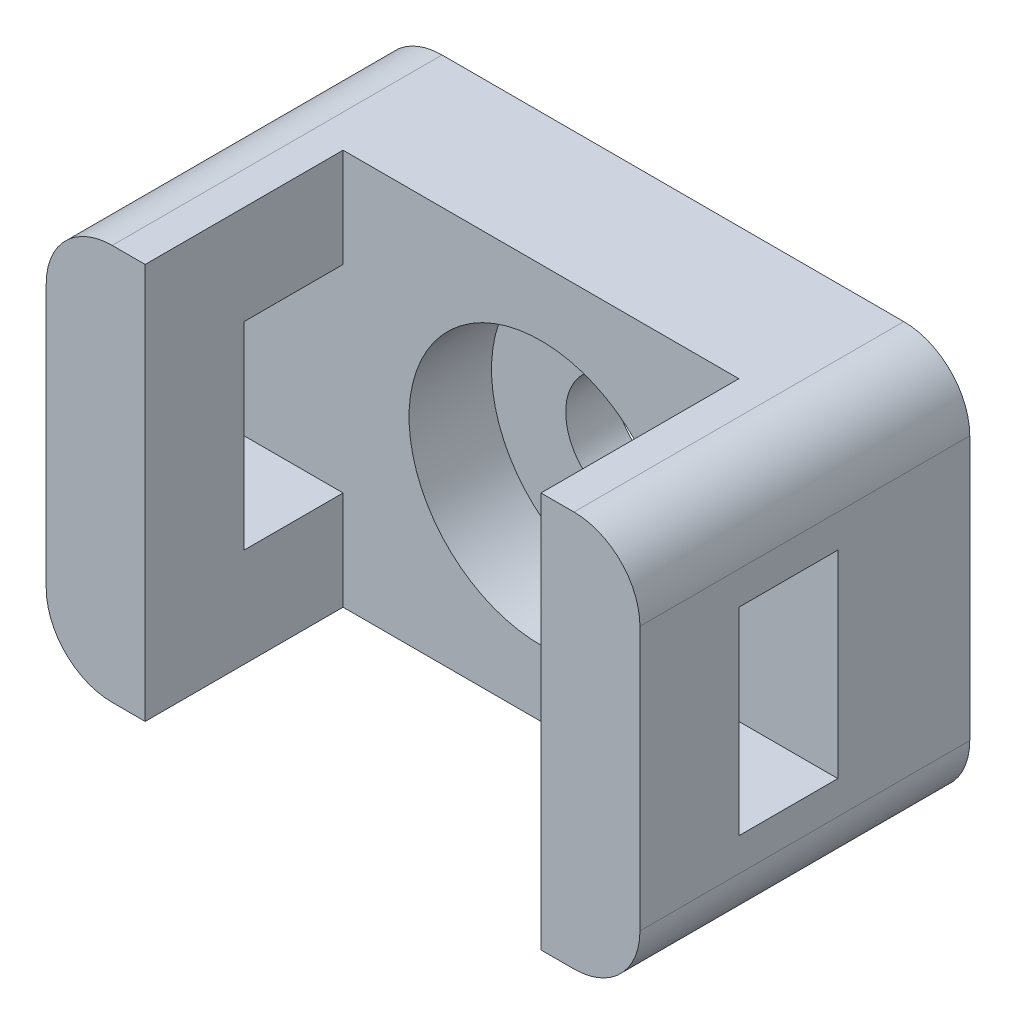
ISO-10303-21;
HEADER;
FILE_DESCRIPTION(('STEP AP214'),'2;1');
FILE_NAME('part.step','',(''),(''),'','','');
FILE_SCHEMA(('AUTOMOTIVE_DESIGN { 1 0 10303 214 1 1 1 1 }'));
ENDSEC;
DATA;
#1=APPLICATION_CONTEXT('core data for automotive mechanical design processes');
#2=APPLICATION_PROTOCOL_DEFINITION('international standard','automotive_design',2000,#1);
#3=PRODUCT_CONTEXT('',#1,'mechanical');
#4=PRODUCT('Part','Part','',(#3));
#5=PRODUCT_RELATED_PRODUCT_CATEGORY('part','',(#4));
#6=PRODUCT_DEFINITION_FORMATION('','',#4);
#7=PRODUCT_DEFINITION_CONTEXT('part definition',#1,'design');
#8=PRODUCT_DEFINITION('design','',#6,#7);
#9=PRODUCT_DEFINITION_SHAPE('','',#8);
#10=(LENGTH_UNIT() NAMED_UNIT(*) SI_UNIT(.MILLI.,.METRE.));
#11=(NAMED_UNIT(*) PLANE_ANGLE_UNIT() SI_UNIT($,.RADIAN.));
#12=(NAMED_UNIT(*) SI_UNIT($,.STERADIAN.) SOLID_ANGLE_UNIT());
#13=UNCERTAINTY_MEASURE_WITH_UNIT(LENGTH_MEASURE(1.E-05),#10,'distance_accuracy_value','');
#14=(GEOMETRIC_REPRESENTATION_CONTEXT(3) GLOBAL_UNCERTAINTY_ASSIGNED_CONTEXT((#13)) GLOBAL_UNIT_ASSIGNED_CONTEXT((#10,
#11,#12)) REPRESENTATION_CONTEXT('',''));
#15=CARTESIAN_POINT('',(0.,0.,0.));
#16=DIRECTION('',(0.,0.,1.));
#17=DIRECTION('',(1.,0.,0.));
#18=AXIS2_PLACEMENT_3D('',#15,#16,#17);
#19=CARTESIAN_POINT('',(0.,0.,0.));
#20=DIRECTION('',(0.,0.,1.));
#21=DIRECTION('',(1.,0.,0.));
#22=AXIS2_PLACEMENT_3D('',#19,#20,#21);
#23=CYLINDRICAL_SURFACE('',#22,1.75);
#24=CARTESIAN_POINT('',(0.,0.,0.));
#25=DIRECTION('',(0.,0.,1.));
#26=DIRECTION('',(1.,0.,0.));
#27=AXIS2_PLACEMENT_3D('',#24,#25,#26);
#28=CIRCLE('',#27,1.75);
#29=CARTESIAN_POINT('',(1.75,0.,0.));
#30=VERTEX_POINT('',#29);
#31=EDGE_CURVE('E217',#30,#30,#28,.T.);
#32=ORIENTED_EDGE('',*,*,#31,.F.);
#33=EDGE_LOOP('',(#32));
#34=FACE_BOUND('',#33,.T.);
#35=CARTESIAN_POINT('',(0.,0.,1.5));
#36=DIRECTION('',(0.,0.,1.));
#37=DIRECTION('',(1.,0.,0.));
#38=AXIS2_PLACEMENT_3D('',#35,#36,#37);
#39=CIRCLE('',#38,1.75);
#40=CARTESIAN_POINT('',(1.75,0.,1.5));
#41=VERTEX_POINT('',#40);
#42=EDGE_CURVE('E302',#41,#41,#39,.F.);
#43=ORIENTED_EDGE('',*,*,#42,.F.);
#44=EDGE_LOOP('',(#43));
#45=FACE_BOUND('',#44,.T.);
#46=ADVANCED_FACE('F35',(#34,#45),#23,.F.);
#47=CARTESIAN_POINT('',(0.,0.,4.));
#48=DIRECTION('',(0.,0.,1.));
#49=DIRECTION('',(1.,0.,0.));
#50=AXIS2_PLACEMENT_3D('',#47,#48,#49);
#51=PLANE('',#50);
#52=CARTESIAN_POINT('',(0.,0.,4.));
#53=DIRECTION('',(0.,0.,1.));
#54=DIRECTION('',(1.,0.,0.));
#55=AXIS2_PLACEMENT_3D('',#52,#53,#54);
#56=CIRCLE('',#55,4.);
#57=CARTESIAN_POINT('',(4.,0.,4.));
#58=VERTEX_POINT('',#57);
#59=EDGE_CURVE('E597',#58,#58,#56,.T.);
#60=ORIENTED_EDGE('',*,*,#59,.F.);
#61=EDGE_LOOP('',(#60));
#62=FACE_BOUND('',#61,.T.);
#63=DIRECTION('',(0.,-1.,0.));
#64=VECTOR('',#63,1.);
#65=CARTESIAN_POINT('',(-9.,6.,4.));
#66=LINE('',#65,#64);
#67=CARTESIAN_POINT('',(-9.,3.,4.));
#68=VERTEX_POINT('',#67);
#69=CARTESIAN_POINT('',(-9.,-3.,4.));
#70=VERTEX_POINT('',#69);
#71=EDGE_CURVE('E282',#68,#70,#66,.T.);
#72=ORIENTED_EDGE('',*,*,#71,.T.);
#73=DIRECTION('',(-1.,0.,0.));
#74=VECTOR('',#73,1.);
#75=CARTESIAN_POINT('',(-6.,-3.,4.));
#76=LINE('',#75,#74);
#77=CARTESIAN_POINT('',(-6.,-3.,4.));
#78=VERTEX_POINT('',#77);
#79=EDGE_CURVE('E230',#78,#70,#76,.T.);
#80=ORIENTED_EDGE('',*,*,#79,.F.);
#81=DIRECTION('',(0.,1.,0.));
#82=VECTOR('',#81,1.);
#83=CARTESIAN_POINT('',(-6.,-3.,4.));
#84=LINE('',#83,#82);
#85=CARTESIAN_POINT('',(-6.,-6.,4.));
#86=VERTEX_POINT('',#85);
#87=EDGE_CURVE('E206',#86,#78,#84,.T.);
#88=ORIENTED_EDGE('',*,*,#87,.F.);
#89=DIRECTION('',(1.,0.,0.));
#90=VECTOR('',#89,1.);
#91=CARTESIAN_POINT('',(-9.,-6.,4.));
#92=LINE('',#91,#90);
#93=CARTESIAN_POINT('',(6.,-6.,4.));
#94=VERTEX_POINT('',#93);
#95=EDGE_CURVE('E284',#86,#94,#92,.T.);
#96=ORIENTED_EDGE('',*,*,#95,.T.);
#97=DIRECTION('',(0.,1.,0.));
#98=VECTOR('',#97,1.);
#99=CARTESIAN_POINT('',(6.,-3.,4.));
#100=LINE('',#99,#98);
#101=CARTESIAN_POINT('',(6.,-3.,4.));
#102=VERTEX_POINT('',#101);
#103=EDGE_CURVE('E247',#94,#102,#100,.T.);
#104=ORIENTED_EDGE('',*,*,#103,.T.);
#105=DIRECTION('',(1.,0.,0.));
#106=VECTOR('',#105,1.);
#107=CARTESIAN_POINT('',(6.,-3.,4.));
#108=LINE('',#107,#106);
#109=CARTESIAN_POINT('',(9.,-3.,4.));
#110=VERTEX_POINT('',#109);
#111=EDGE_CURVE('E276',#102,#110,#108,.T.);
#112=ORIENTED_EDGE('',*,*,#111,.T.);
#113=DIRECTION('',(0.,1.,0.));
#114=VECTOR('',#113,1.);
#115=CARTESIAN_POINT('',(9.,6.,4.));
#116=LINE('',#115,#114);
#117=CARTESIAN_POINT('',(9.,3.,4.));
#118=VERTEX_POINT('',#117);
#119=EDGE_CURVE('E287',#110,#118,#116,.T.);
#120=ORIENTED_EDGE('',*,*,#119,.T.);
#121=DIRECTION('',(1.,0.,0.));
#122=VECTOR('',#121,1.);
#123=CARTESIAN_POINT('',(6.,3.,4.));
#124=LINE('',#123,#122);
#125=CARTESIAN_POINT('',(6.,3.,4.));
#126=VERTEX_POINT('',#125);
#127=EDGE_CURVE('E268',#126,#118,#124,.T.);
#128=ORIENTED_EDGE('',*,*,#127,.F.);
#129=DIRECTION('',(0.,1.,0.));
#130=VECTOR('',#129,1.);
#131=CARTESIAN_POINT('',(6.,6.,4.));
#132=LINE('',#131,#130);
#133=CARTESIAN_POINT('',(6.,6.,4.));
#134=VERTEX_POINT('',#133);
#135=EDGE_CURVE('E235',#126,#134,#132,.T.);
#136=ORIENTED_EDGE('',*,*,#135,.T.);
#137=DIRECTION('',(-1.,0.,0.));
#138=VECTOR('',#137,1.);
#139=CARTESIAN_POINT('',(-9.,6.,4.));
#140=LINE('',#139,#138);
#141=CARTESIAN_POINT('',(-6.,6.,4.));
#142=VERTEX_POINT('',#141);
#143=EDGE_CURVE('E289',#134,#142,#140,.T.);
#144=ORIENTED_EDGE('',*,*,#143,.T.);
#145=DIRECTION('',(0.,1.,0.));
#146=VECTOR('',#145,1.);
#147=CARTESIAN_POINT('',(-6.,6.,4.));
#148=LINE('',#147,#146);
#149=CARTESIAN_POINT('',(-6.,3.,4.));
#150=VERTEX_POINT('',#149);
#151=EDGE_CURVE('E199',#150,#142,#148,.T.);
#152=ORIENTED_EDGE('',*,*,#151,.F.);
#153=DIRECTION('',(-1.,0.,0.));
#154=VECTOR('',#153,1.);
#155=CARTESIAN_POINT('',(-6.,3.,4.));
#156=LINE('',#155,#154);
#157=EDGE_CURVE('E195',#150,#68,#156,.T.);
#158=ORIENTED_EDGE('',*,*,#157,.T.);
#159=EDGE_LOOP('',(#72,#80,#88,#96,#104,#112,#120,#128,#136,#144,#152,#158));
#160=FACE_BOUND('',#159,.T.);
#161=ADVANCED_FACE('F377',(#62,#160),#51,.T.);
#162=CARTESIAN_POINT('',(-9.,6.,4.));
#163=DIRECTION('',(1.,0.,0.));
#164=DIRECTION('',(0.,1.,0.));
#165=AXIS2_PLACEMENT_3D('',#162,#163,#164);
#166=PLANE('',#165);
#167=DIRECTION('',(0.,0.,1.));
#168=VECTOR('',#167,1.);
#169=CARTESIAN_POINT('',(-9.,-3.,4.));
#170=LINE('',#169,#168);
#171=CARTESIAN_POINT('',(-9.,-3.,7.));
#172=VERTEX_POINT('',#171);
#173=EDGE_CURVE('E219',#70,#172,#170,.T.);
#174=ORIENTED_EDGE('',*,*,#173,.F.);
#175=ORIENTED_EDGE('',*,*,#71,.F.);
#176=DIRECTION('',(0.,0.,-1.));
#177=VECTOR('',#176,1.);
#178=CARTESIAN_POINT('',(-9.,3.,4.));
#179=LINE('',#178,#177);
#180=CARTESIAN_POINT('',(-9.,3.,7.));
#181=VERTEX_POINT('',#180);
#182=EDGE_CURVE('E215',#181,#68,#179,.T.);
#183=ORIENTED_EDGE('',*,*,#182,.F.);
#184=DIRECTION('',(0.,1.,0.));
#185=VECTOR('',#184,1.);
#186=CARTESIAN_POINT('',(-9.,3.,7.));
#187=LINE('',#186,#185);
#188=EDGE_CURVE('E190',#172,#181,#187,.T.);
#189=ORIENTED_EDGE('',*,*,#188,.F.);
#190=EDGE_LOOP('',(#174,#175,#183,#189));
#191=FACE_BOUND('',#190,.T.);
#192=DIRECTION('',(0.,-1.,0.));
#193=VECTOR('',#192,1.);
#194=CARTESIAN_POINT('',(-9.,6.,0.));
#195=LINE('',#194,#193);
#196=CARTESIAN_POINT('',(-9.,4.,0.));
#197=VERTEX_POINT('',#196);
#198=CARTESIAN_POINT('',(-9.,-4.,0.));
#199=VERTEX_POINT('',#198);
#200=EDGE_CURVE('E271',#197,#199,#195,.T.);
#201=ORIENTED_EDGE('',*,*,#200,.T.);
#202=DIRECTION('',(0.,0.,-1.));
#203=VECTOR('',#202,1.);
#204=CARTESIAN_POINT('',(-9.,-4.,4.));
#205=LINE('',#204,#203);
#206=CARTESIAN_POINT('',(-9.,-4.,10.));
#207=VERTEX_POINT('',#206);
#208=EDGE_CURVE('E321',#199,#207,#205,.F.);
#209=ORIENTED_EDGE('',*,*,#208,.T.);
#210=DIRECTION('',(0.,-1.,0.));
#211=VECTOR('',#210,1.);
#212=CARTESIAN_POINT('',(-9.,6.,10.));
#213=LINE('',#212,#211);
#214=CARTESIAN_POINT('',(-9.,4.,10.));
#215=VERTEX_POINT('',#214);
#216=EDGE_CURVE('E201',#215,#207,#213,.T.);
#217=ORIENTED_EDGE('',*,*,#216,.F.);
#218=DIRECTION('',(0.,0.,-1.));
#219=VECTOR('',#218,1.);
#220=CARTESIAN_POINT('',(-9.,4.,4.));
#221=LINE('',#220,#219);
#222=EDGE_CURVE('E318',#215,#197,#221,.T.);
#223=ORIENTED_EDGE('',*,*,#222,.T.);
#224=EDGE_LOOP('',(#201,#209,#217,#223));
#225=FACE_BOUND('',#224,.T.);
#226=ADVANCED_FACE('F351',(#191,#225),#166,.F.);
#227=CARTESIAN_POINT('',(-9.,-6.,4.));
#228=DIRECTION('',(0.,1.,0.));
#229=DIRECTION('',(0.,0.,1.));
#230=AXIS2_PLACEMENT_3D('',#227,#228,#229);
#231=PLANE('',#230);
#232=DIRECTION('',(-1.,0.,0.));
#233=VECTOR('',#232,1.);
#234=CARTESIAN_POINT('',(-6.,-6.,10.));
#235=LINE('',#234,#233);
#236=CARTESIAN_POINT('',(-6.,-6.,10.));
#237=VERTEX_POINT('',#236);
#238=CARTESIAN_POINT('',(-7.,-6.,10.));
#239=VERTEX_POINT('',#238);
#240=EDGE_CURVE('E227',#237,#239,#235,.T.);
#241=ORIENTED_EDGE('',*,*,#240,.T.);
#242=DIRECTION('',(0.,0.,-1.));
#243=VECTOR('',#242,1.);
#244=CARTESIAN_POINT('',(-7.,-6.,4.));
#245=LINE('',#244,#243);
#246=CARTESIAN_POINT('',(-7.,-6.,0.));
#247=VERTEX_POINT('',#246);
#248=EDGE_CURVE('E307',#239,#247,#245,.T.);
#249=ORIENTED_EDGE('',*,*,#248,.T.);
#250=DIRECTION('',(1.,0.,0.));
#251=VECTOR('',#250,1.);
#252=CARTESIAN_POINT('',(-9.,-6.,0.));
#253=LINE('',#252,#251);
#254=CARTESIAN_POINT('',(7.,-6.,0.));
#255=VERTEX_POINT('',#254);
#256=EDGE_CURVE('E294',#247,#255,#253,.T.);
#257=ORIENTED_EDGE('',*,*,#256,.T.);
#258=DIRECTION('',(0.,0.,-1.));
#259=VECTOR('',#258,1.);
#260=CARTESIAN_POINT('',(7.,-6.,4.));
#261=LINE('',#260,#259);
#262=CARTESIAN_POINT('',(7.,-6.,10.));
#263=VERTEX_POINT('',#262);
#264=EDGE_CURVE('E291',#255,#263,#261,.F.);
#265=ORIENTED_EDGE('',*,*,#264,.T.);
#266=DIRECTION('',(1.,0.,0.));
#267=VECTOR('',#266,1.);
#268=CARTESIAN_POINT('',(6.,-6.,10.));
#269=LINE('',#268,#267);
#270=CARTESIAN_POINT('',(6.,-6.,10.));
#271=VERTEX_POINT('',#270);
#272=EDGE_CURVE('E279',#271,#263,#269,.T.);
#273=ORIENTED_EDGE('',*,*,#272,.F.);
#274=DIRECTION('',(0.,0.,-1.));
#275=VECTOR('',#274,1.);
#276=CARTESIAN_POINT('',(6.,-6.,4.));
#277=LINE('',#276,#275);
#278=EDGE_CURVE('E244',#271,#94,#277,.T.);
#279=ORIENTED_EDGE('',*,*,#278,.T.);
#280=ORIENTED_EDGE('',*,*,#95,.F.);
#281=DIRECTION('',(0.,0.,-1.));
#282=VECTOR('',#281,1.);
#283=CARTESIAN_POINT('',(-6.,-6.,4.));
#284=LINE('',#283,#282);
#285=EDGE_CURVE('E208',#237,#86,#284,.T.);
#286=ORIENTED_EDGE('',*,*,#285,.F.);
#287=EDGE_LOOP('',(#241,#249,#257,#265,#273,#279,#280,#286));
#288=FACE_BOUND('',#287,.T.);
#289=ADVANCED_FACE('F361',(#288),#231,.F.);
#290=CARTESIAN_POINT('',(9.,6.,4.));
#291=DIRECTION('',(-1.,0.,0.));
#292=DIRECTION('',(0.,-1.,0.));
#293=AXIS2_PLACEMENT_3D('',#290,#291,#292);
#294=PLANE('',#293);
#295=DIRECTION('',(0.,-1.,0.));
#296=VECTOR('',#295,1.);
#297=CARTESIAN_POINT('',(9.,6.,10.));
#298=LINE('',#297,#296);
#299=CARTESIAN_POINT('',(9.,4.,10.));
#300=VERTEX_POINT('',#299);
#301=CARTESIAN_POINT('',(9.,-4.,10.));
#302=VERTEX_POINT('',#301);
#303=EDGE_CURVE('E226',#300,#302,#298,.T.);
#304=ORIENTED_EDGE('',*,*,#303,.T.);
#305=DIRECTION('',(0.,0.,-1.));
#306=VECTOR('',#305,1.);
#307=CARTESIAN_POINT('',(9.,-4.,4.));
#308=LINE('',#307,#306);
#309=CARTESIAN_POINT('',(9.,-4.,0.));
#310=VERTEX_POINT('',#309);
#311=EDGE_CURVE('E329',#302,#310,#308,.T.);
#312=ORIENTED_EDGE('',*,*,#311,.T.);
#313=DIRECTION('',(0.,1.,0.));
#314=VECTOR('',#313,1.);
#315=CARTESIAN_POINT('',(9.,6.,0.));
#316=LINE('',#315,#314);
#317=CARTESIAN_POINT('',(9.,4.,0.));
#318=VERTEX_POINT('',#317);
#319=EDGE_CURVE('E297',#310,#318,#316,.T.);
#320=ORIENTED_EDGE('',*,*,#319,.T.);
#321=DIRECTION('',(0.,0.,-1.));
#322=VECTOR('',#321,1.);
#323=CARTESIAN_POINT('',(9.,4.,4.));
#324=LINE('',#323,#322);
#325=EDGE_CURVE('E327',#318,#300,#324,.F.);
#326=ORIENTED_EDGE('',*,*,#325,.T.);
#327=EDGE_LOOP('',(#304,#312,#320,#326));
#328=FACE_BOUND('',#327,.T.);
#329=DIRECTION('',(0.,0.,-1.));
#330=VECTOR('',#329,1.);
#331=CARTESIAN_POINT('',(9.,3.,4.));
#332=LINE('',#331,#330);
#333=CARTESIAN_POINT('',(9.,3.,7.));
#334=VERTEX_POINT('',#333);
#335=EDGE_CURVE('E238',#334,#118,#332,.T.);
#336=ORIENTED_EDGE('',*,*,#335,.T.);
#337=ORIENTED_EDGE('',*,*,#119,.F.);
#338=DIRECTION('',(0.,0.,1.));
#339=VECTOR('',#338,1.);
#340=CARTESIAN_POINT('',(9.,-3.,4.));
#341=LINE('',#340,#339);
#342=CARTESIAN_POINT('',(9.,-3.,7.));
#343=VERTEX_POINT('',#342);
#344=EDGE_CURVE('E260',#110,#343,#341,.T.);
#345=ORIENTED_EDGE('',*,*,#344,.T.);
#346=DIRECTION('',(0.,1.,0.));
#347=VECTOR('',#346,1.);
#348=CARTESIAN_POINT('',(9.,3.,7.));
#349=LINE('',#348,#347);
#350=EDGE_CURVE('E263',#343,#334,#349,.T.);
#351=ORIENTED_EDGE('',*,*,#350,.T.);
#352=EDGE_LOOP('',(#336,#337,#345,#351));
#353=FACE_BOUND('',#352,.T.);
#354=ADVANCED_FACE('F368',(#328,#353),#294,.F.);
#355=CARTESIAN_POINT('',(-9.,6.,4.));
#356=DIRECTION('',(0.,-1.,0.));
#357=DIRECTION('',(0.,0.,-1.));
#358=AXIS2_PLACEMENT_3D('',#355,#356,#357);
#359=PLANE('',#358);
#360=DIRECTION('',(-1.,0.,0.));
#361=VECTOR('',#360,1.);
#362=CARTESIAN_POINT('',(-9.,6.,0.));
#363=LINE('',#362,#361);
#364=CARTESIAN_POINT('',(7.,6.,0.));
#365=VERTEX_POINT('',#364);
#366=CARTESIAN_POINT('',(-7.,6.,0.));
#367=VERTEX_POINT('',#366);
#368=EDGE_CURVE('E285',#365,#367,#363,.T.);
#369=ORIENTED_EDGE('',*,*,#368,.T.);
#370=DIRECTION('',(0.,0.,-1.));
#371=VECTOR('',#370,1.);
#372=CARTESIAN_POINT('',(-7.,6.,4.));
#373=LINE('',#372,#371);
#374=CARTESIAN_POINT('',(-7.,6.,10.));
#375=VERTEX_POINT('',#374);
#376=EDGE_CURVE('E11',#367,#375,#373,.F.);
#377=ORIENTED_EDGE('',*,*,#376,.T.);
#378=DIRECTION('',(-1.,0.,0.));
#379=VECTOR('',#378,1.);
#380=CARTESIAN_POINT('',(-6.,6.,10.));
#381=LINE('',#380,#379);
#382=CARTESIAN_POINT('',(-6.,6.,10.));
#383=VERTEX_POINT('',#382);
#384=EDGE_CURVE('E223',#383,#375,#381,.T.);
#385=ORIENTED_EDGE('',*,*,#384,.F.);
#386=DIRECTION('',(0.,0.,1.));
#387=VECTOR('',#386,1.);
#388=CARTESIAN_POINT('',(-6.,6.,4.));
#389=LINE('',#388,#387);
#390=EDGE_CURVE('E213',#142,#383,#389,.T.);
#391=ORIENTED_EDGE('',*,*,#390,.F.);
#392=ORIENTED_EDGE('',*,*,#143,.F.);
#393=DIRECTION('',(0.,0.,1.));
#394=VECTOR('',#393,1.);
#395=CARTESIAN_POINT('',(6.,6.,4.));
#396=LINE('',#395,#394);
#397=CARTESIAN_POINT('',(6.,6.,10.));
#398=VERTEX_POINT('',#397);
#399=EDGE_CURVE('E237',#134,#398,#396,.T.);
#400=ORIENTED_EDGE('',*,*,#399,.T.);
#401=DIRECTION('',(1.,0.,0.));
#402=VECTOR('',#401,1.);
#403=CARTESIAN_POINT('',(6.,6.,10.));
#404=LINE('',#403,#402);
#405=CARTESIAN_POINT('',(7.,6.,10.));
#406=VERTEX_POINT('',#405);
#407=EDGE_CURVE('E258',#398,#406,#404,.T.);
#408=ORIENTED_EDGE('',*,*,#407,.T.);
#409=DIRECTION('',(0.,0.,-1.));
#410=VECTOR('',#409,1.);
#411=CARTESIAN_POINT('',(7.,6.,4.));
#412=LINE('',#411,#410);
#413=EDGE_CURVE('E43',#406,#365,#412,.T.);
#414=ORIENTED_EDGE('',*,*,#413,.T.);
#415=EDGE_LOOP('',(#369,#377,#385,#391,#392,#400,#408,#414));
#416=FACE_BOUND('',#415,.T.);
#417=ADVANCED_FACE('F337',(#416),#359,.F.);
#418=CARTESIAN_POINT('',(0.,0.,0.));
#419=DIRECTION('',(0.,0.,1.));
#420=DIRECTION('',(1.,0.,0.));
#421=AXIS2_PLACEMENT_3D('',#418,#419,#420);
#422=PLANE('',#421);
#423=ORIENTED_EDGE('',*,*,#31,.T.);
#424=EDGE_LOOP('',(#423));
#425=FACE_BOUND('',#424,.T.);
#426=ORIENTED_EDGE('',*,*,#256,.F.);
#427=CARTESIAN_POINT('',(-7.,-4.,0.));
#428=DIRECTION('',(0.,0.,1.));
#429=DIRECTION('',(1.,0.,0.));
#430=AXIS2_PLACEMENT_3D('',#427,#428,#429);
#431=CIRCLE('',#430,2.);
#432=EDGE_CURVE('E316',#247,#199,#431,.F.);
#433=ORIENTED_EDGE('',*,*,#432,.T.);
#434=ORIENTED_EDGE('',*,*,#200,.F.);
#435=CARTESIAN_POINT('',(-7.,4.,0.));
#436=DIRECTION('',(0.,0.,1.));
#437=DIRECTION('',(1.,0.,0.));
#438=AXIS2_PLACEMENT_3D('',#435,#436,#437);
#439=CIRCLE('',#438,2.);
#440=EDGE_CURVE('E312',#197,#367,#439,.F.);
#441=ORIENTED_EDGE('',*,*,#440,.T.);
#442=ORIENTED_EDGE('',*,*,#368,.F.);
#443=CARTESIAN_POINT('',(7.,4.,0.));
#444=DIRECTION('',(0.,0.,1.));
#445=DIRECTION('',(1.,0.,0.));
#446=AXIS2_PLACEMENT_3D('',#443,#444,#445);
#447=CIRCLE('',#446,2.);
#448=EDGE_CURVE('E310',#365,#318,#447,.F.);
#449=ORIENTED_EDGE('',*,*,#448,.T.);
#450=ORIENTED_EDGE('',*,*,#319,.F.);
#451=CARTESIAN_POINT('',(7.,-4.,0.));
#452=DIRECTION('',(0.,0.,1.));
#453=DIRECTION('',(1.,0.,0.));
#454=AXIS2_PLACEMENT_3D('',#451,#452,#453);
#455=CIRCLE('',#454,2.);
#456=EDGE_CURVE('E314',#310,#255,#455,.F.);
#457=ORIENTED_EDGE('',*,*,#456,.T.);
#458=EDGE_LOOP('',(#426,#433,#434,#441,#442,#449,#450,#457));
#459=FACE_BOUND('',#458,.T.);
#460=ADVANCED_FACE('F342',(#425,#459),#422,.F.);
#461=CARTESIAN_POINT('',(6.,3.,4.));
#462=DIRECTION('',(0.,-1.,0.));
#463=DIRECTION('',(1.,0.,0.));
#464=AXIS2_PLACEMENT_3D('',#461,#462,#463);
#465=PLANE('',#464);
#466=ORIENTED_EDGE('',*,*,#335,.F.);
#467=DIRECTION('',(1.,0.,0.));
#468=VECTOR('',#467,1.);
#469=CARTESIAN_POINT('',(6.,3.,7.));
#470=LINE('',#469,#468);
#471=CARTESIAN_POINT('',(6.,3.,7.));
#472=VERTEX_POINT('',#471);
#473=EDGE_CURVE('E272',#472,#334,#470,.T.);
#474=ORIENTED_EDGE('',*,*,#473,.F.);
#475=DIRECTION('',(0.,0.,-1.));
#476=VECTOR('',#475,1.);
#477=CARTESIAN_POINT('',(6.,3.,4.));
#478=LINE('',#477,#476);
#479=EDGE_CURVE('E255',#472,#126,#478,.T.);
#480=ORIENTED_EDGE('',*,*,#479,.T.);
#481=ORIENTED_EDGE('',*,*,#127,.T.);
#482=EDGE_LOOP('',(#466,#474,#480,#481));
#483=FACE_BOUND('',#482,.T.);
#484=ADVANCED_FACE('F408',(#483),#465,.T.);
#485=CARTESIAN_POINT('',(6.,3.,7.));
#486=DIRECTION('',(0.,0.,-1.));
#487=DIRECTION('',(-1.,0.,0.));
#488=AXIS2_PLACEMENT_3D('',#485,#486,#487);
#489=PLANE('',#488);
#490=ORIENTED_EDGE('',*,*,#350,.F.);
#491=DIRECTION('',(1.,0.,0.));
#492=VECTOR('',#491,1.);
#493=CARTESIAN_POINT('',(6.,-3.,7.));
#494=LINE('',#493,#492);
#495=CARTESIAN_POINT('',(6.,-3.,7.));
#496=VERTEX_POINT('',#495);
#497=EDGE_CURVE('E274',#496,#343,#494,.T.);
#498=ORIENTED_EDGE('',*,*,#497,.F.);
#499=DIRECTION('',(0.,1.,0.));
#500=VECTOR('',#499,1.);
#501=CARTESIAN_POINT('',(6.,3.,7.));
#502=LINE('',#501,#500);
#503=EDGE_CURVE('E252',#496,#472,#502,.T.);
#504=ORIENTED_EDGE('',*,*,#503,.T.);
#505=ORIENTED_EDGE('',*,*,#473,.T.);
#506=EDGE_LOOP('',(#490,#498,#504,#505));
#507=FACE_BOUND('',#506,.T.);
#508=ADVANCED_FACE('F411',(#507),#489,.T.);
#509=CARTESIAN_POINT('',(6.,-3.,4.));
#510=DIRECTION('',(0.,1.,0.));
#511=DIRECTION('',(0.,0.,1.));
#512=AXIS2_PLACEMENT_3D('',#509,#510,#511);
#513=PLANE('',#512);
#514=ORIENTED_EDGE('',*,*,#344,.F.);
#515=ORIENTED_EDGE('',*,*,#111,.F.);
#516=DIRECTION('',(0.,0.,1.));
#517=VECTOR('',#516,1.);
#518=CARTESIAN_POINT('',(6.,-3.,4.));
#519=LINE('',#518,#517);
#520=EDGE_CURVE('E249',#102,#496,#519,.T.);
#521=ORIENTED_EDGE('',*,*,#520,.T.);
#522=ORIENTED_EDGE('',*,*,#497,.T.);
#523=EDGE_LOOP('',(#514,#515,#521,#522));
#524=FACE_BOUND('',#523,.T.);
#525=ADVANCED_FACE('F415',(#524),#513,.T.);
#526=CARTESIAN_POINT('',(6.,6.,10.));
#527=DIRECTION('',(0.,0.,1.));
#528=DIRECTION('',(0.,-1.,0.));
#529=AXIS2_PLACEMENT_3D('',#526,#527,#528);
#530=PLANE('',#529);
#531=ORIENTED_EDGE('',*,*,#272,.T.);
#532=CARTESIAN_POINT('',(7.,-4.,10.));
#533=DIRECTION('',(0.,0.,1.));
#534=DIRECTION('',(0.,-1.,0.));
#535=AXIS2_PLACEMENT_3D('',#532,#533,#534);
#536=CIRCLE('',#535,2.);
#537=EDGE_CURVE('E56',#263,#302,#536,.T.);
#538=ORIENTED_EDGE('',*,*,#537,.T.);
#539=ORIENTED_EDGE('',*,*,#303,.F.);
#540=CARTESIAN_POINT('',(7.,4.,10.));
#541=DIRECTION('',(0.,0.,1.));
#542=DIRECTION('',(0.,-1.,0.));
#543=AXIS2_PLACEMENT_3D('',#540,#541,#542);
#544=CIRCLE('',#543,2.);
#545=EDGE_CURVE('E50',#300,#406,#544,.T.);
#546=ORIENTED_EDGE('',*,*,#545,.T.);
#547=ORIENTED_EDGE('',*,*,#407,.F.);
#548=DIRECTION('',(0.,-1.,0.));
#549=VECTOR('',#548,1.);
#550=CARTESIAN_POINT('',(6.,6.,10.));
#551=LINE('',#550,#549);
#552=EDGE_CURVE('E241',#398,#271,#551,.T.);
#553=ORIENTED_EDGE('',*,*,#552,.T.);
#554=EDGE_LOOP('',(#531,#538,#539,#546,#547,#553));
#555=FACE_BOUND('',#554,.T.);
#556=ADVANCED_FACE('F371',(#555),#530,.T.);
#557=CARTESIAN_POINT('',(6.,0.,0.));
#558=DIRECTION('',(-1.,0.,0.));
#559=DIRECTION('',(0.,0.,1.));
#560=AXIS2_PLACEMENT_3D('',#557,#558,#559);
#561=PLANE('',#560);
#562=ORIENTED_EDGE('',*,*,#135,.F.);
#563=ORIENTED_EDGE('',*,*,#479,.F.);
#564=ORIENTED_EDGE('',*,*,#503,.F.);
#565=ORIENTED_EDGE('',*,*,#520,.F.);
#566=ORIENTED_EDGE('',*,*,#103,.F.);
#567=ORIENTED_EDGE('',*,*,#278,.F.);
#568=ORIENTED_EDGE('',*,*,#552,.F.);
#569=ORIENTED_EDGE('',*,*,#399,.F.);
#570=EDGE_LOOP('',(#562,#563,#564,#565,#566,#567,#568,#569));
#571=FACE_BOUND('',#570,.T.);
#572=ADVANCED_FACE('F397',(#571),#561,.T.);
#573=CARTESIAN_POINT('',(-6.,6.,10.));
#574=DIRECTION('',(0.,0.,-1.));
#575=DIRECTION('',(0.,1.,0.));
#576=AXIS2_PLACEMENT_3D('',#573,#574,#575);
#577=PLANE('',#576);
#578=ORIENTED_EDGE('',*,*,#216,.T.);
#579=CARTESIAN_POINT('',(-7.,-4.,10.));
#580=DIRECTION('',(0.,0.,-1.));
#581=DIRECTION('',(0.,1.,0.));
#582=AXIS2_PLACEMENT_3D('',#579,#580,#581);
#583=CIRCLE('',#582,2.);
#584=EDGE_CURVE('E325',#207,#239,#583,.F.);
#585=ORIENTED_EDGE('',*,*,#584,.T.);
#586=ORIENTED_EDGE('',*,*,#240,.F.);
#587=DIRECTION('',(0.,-1.,0.));
#588=VECTOR('',#587,1.);
#589=CARTESIAN_POINT('',(-6.,6.,10.));
#590=LINE('',#589,#588);
#591=EDGE_CURVE('E211',#383,#237,#590,.T.);
#592=ORIENTED_EDGE('',*,*,#591,.F.);
#593=ORIENTED_EDGE('',*,*,#384,.T.);
#594=CARTESIAN_POINT('',(-7.,4.,10.));
#595=DIRECTION('',(0.,0.,-1.));
#596=DIRECTION('',(0.,1.,0.));
#597=AXIS2_PLACEMENT_3D('',#594,#595,#596);
#598=CIRCLE('',#597,2.);
#599=EDGE_CURVE('E323',#375,#215,#598,.F.);
#600=ORIENTED_EDGE('',*,*,#599,.T.);
#601=EDGE_LOOP('',(#578,#585,#586,#592,#593,#600));
#602=FACE_BOUND('',#601,.T.);
#603=ADVANCED_FACE('F355',(#602),#577,.F.);
#604=CARTESIAN_POINT('',(-6.,-3.,4.));
#605=DIRECTION('',(0.,-1.,0.));
#606=DIRECTION('',(0.,0.,-1.));
#607=AXIS2_PLACEMENT_3D('',#604,#605,#606);
#608=PLANE('',#607);
#609=ORIENTED_EDGE('',*,*,#173,.T.);
#610=DIRECTION('',(-1.,0.,0.));
#611=VECTOR('',#610,1.);
#612=CARTESIAN_POINT('',(-6.,-3.,7.));
#613=LINE('',#612,#611);
#614=CARTESIAN_POINT('',(-6.,-3.,7.));
#615=VERTEX_POINT('',#614);
#616=EDGE_CURVE('E194',#615,#172,#613,.T.);
#617=ORIENTED_EDGE('',*,*,#616,.F.);
#618=DIRECTION('',(0.,0.,1.));
#619=VECTOR('',#618,1.);
#620=CARTESIAN_POINT('',(-6.,-3.,4.));
#621=LINE('',#620,#619);
#622=EDGE_CURVE('E181',#78,#615,#621,.T.);
#623=ORIENTED_EDGE('',*,*,#622,.F.);
#624=ORIENTED_EDGE('',*,*,#79,.T.);
#625=EDGE_LOOP('',(#609,#617,#623,#624));
#626=FACE_BOUND('',#625,.T.);
#627=ADVANCED_FACE('F396',(#626),#608,.F.);
#628=CARTESIAN_POINT('',(-6.,3.,7.));
#629=DIRECTION('',(0.,0.,1.));
#630=DIRECTION('',(1.,0.,0.));
#631=AXIS2_PLACEMENT_3D('',#628,#629,#630);
#632=PLANE('',#631);
#633=ORIENTED_EDGE('',*,*,#188,.T.);
#634=DIRECTION('',(-1.,0.,0.));
#635=VECTOR('',#634,1.);
#636=CARTESIAN_POINT('',(-6.,3.,7.));
#637=LINE('',#636,#635);
#638=CARTESIAN_POINT('',(-6.,3.,7.));
#639=VERTEX_POINT('',#638);
#640=EDGE_CURVE('E187',#639,#181,#637,.T.);
#641=ORIENTED_EDGE('',*,*,#640,.F.);
#642=DIRECTION('',(0.,1.,0.));
#643=VECTOR('',#642,1.);
#644=CARTESIAN_POINT('',(-6.,3.,7.));
#645=LINE('',#644,#643);
#646=EDGE_CURVE('E172',#615,#639,#645,.T.);
#647=ORIENTED_EDGE('',*,*,#646,.F.);
#648=ORIENTED_EDGE('',*,*,#616,.T.);
#649=EDGE_LOOP('',(#633,#641,#647,#648));
#650=FACE_BOUND('',#649,.T.);
#651=ADVANCED_FACE('F188',(#650),#632,.F.);
#652=CARTESIAN_POINT('',(-6.,3.,4.));
#653=DIRECTION('',(0.,1.,0.));
#654=DIRECTION('',(-1.,0.,0.));
#655=AXIS2_PLACEMENT_3D('',#652,#653,#654);
#656=PLANE('',#655);
#657=ORIENTED_EDGE('',*,*,#182,.T.);
#658=ORIENTED_EDGE('',*,*,#157,.F.);
#659=DIRECTION('',(0.,0.,-1.));
#660=VECTOR('',#659,1.);
#661=CARTESIAN_POINT('',(-6.,3.,4.));
#662=LINE('',#661,#660);
#663=EDGE_CURVE('E177',#639,#150,#662,.T.);
#664=ORIENTED_EDGE('',*,*,#663,.F.);
#665=ORIENTED_EDGE('',*,*,#640,.T.);
#666=EDGE_LOOP('',(#657,#658,#664,#665));
#667=FACE_BOUND('',#666,.T.);
#668=ADVANCED_FACE('F197',(#667),#656,.F.);
#669=CARTESIAN_POINT('',(-6.,0.,0.));
#670=DIRECTION('',(1.,0.,0.));
#671=DIRECTION('',(0.,0.,1.));
#672=AXIS2_PLACEMENT_3D('',#669,#670,#671);
#673=PLANE('',#672);
#674=ORIENTED_EDGE('',*,*,#151,.T.);
#675=ORIENTED_EDGE('',*,*,#390,.T.);
#676=ORIENTED_EDGE('',*,*,#591,.T.);
#677=ORIENTED_EDGE('',*,*,#285,.T.);
#678=ORIENTED_EDGE('',*,*,#87,.T.);
#679=ORIENTED_EDGE('',*,*,#622,.T.);
#680=ORIENTED_EDGE('',*,*,#646,.T.);
#681=ORIENTED_EDGE('',*,*,#663,.T.);
#682=EDGE_LOOP('',(#674,#675,#676,#677,#678,#679,#680,#681));
#683=FACE_BOUND('',#682,.T.);
#684=ADVANCED_FACE('F175',(#683),#673,.T.);
#685=CARTESIAN_POINT('',(0.,0.,1.5));
#686=DIRECTION('',(0.,0.,1.));
#687=DIRECTION('',(1.,0.,0.));
#688=AXIS2_PLACEMENT_3D('',#685,#686,#687);
#689=PLANE('',#688);
#690=CARTESIAN_POINT('',(0.,0.,1.5));
#691=DIRECTION('',(0.,0.,1.));
#692=DIRECTION('',(1.,0.,0.));
#693=AXIS2_PLACEMENT_3D('',#690,#691,#692);
#694=CIRCLE('',#693,4.);
#695=CARTESIAN_POINT('',(4.,0.,1.5));
#696=VERTEX_POINT('',#695);
#697=EDGE_CURVE('E305',#696,#696,#694,.T.);
#698=ORIENTED_EDGE('',*,*,#697,.T.);
#699=EDGE_LOOP('',(#698));
#700=FACE_BOUND('',#699,.T.);
#701=ORIENTED_EDGE('',*,*,#42,.T.);
#702=EDGE_LOOP('',(#701));
#703=FACE_BOUND('',#702,.T.);
#704=ADVANCED_FACE('F393',(#700,#703),#689,.T.);
#705=CARTESIAN_POINT('',(0.,0.,1.5));
#706=DIRECTION('',(0.,0.,1.));
#707=DIRECTION('',(1.,0.,0.));
#708=AXIS2_PLACEMENT_3D('',#705,#706,#707);
#709=CYLINDRICAL_SURFACE('',#708,4.);
#710=ORIENTED_EDGE('',*,*,#697,.F.);
#711=EDGE_LOOP('',(#710));
#712=FACE_BOUND('',#711,.T.);
#713=ORIENTED_EDGE('',*,*,#59,.T.);
#714=EDGE_LOOP('',(#713));
#715=FACE_BOUND('',#714,.T.);
#716=ADVANCED_FACE('F389',(#712,#715),#709,.F.);
#717=CARTESIAN_POINT('',(-7.,-4.,4.));
#718=DIRECTION('',(0.,0.,-1.));
#719=DIRECTION('',(-1.,0.,0.));
#720=AXIS2_PLACEMENT_3D('',#717,#718,#719);
#721=CYLINDRICAL_SURFACE('',#720,2.);
#722=ORIENTED_EDGE('',*,*,#584,.F.);
#723=ORIENTED_EDGE('',*,*,#208,.F.);
#724=ORIENTED_EDGE('',*,*,#432,.F.);
#725=ORIENTED_EDGE('',*,*,#248,.F.);
#726=EDGE_LOOP('',(#722,#723,#724,#725));
#727=FACE_BOUND('',#726,.T.);
#728=ADVANCED_FACE('F359',(#727),#721,.T.);
#729=CARTESIAN_POINT('',(7.,-4.,4.));
#730=DIRECTION('',(0.,0.,-1.));
#731=DIRECTION('',(-1.,0.,0.));
#732=AXIS2_PLACEMENT_3D('',#729,#730,#731);
#733=CYLINDRICAL_SURFACE('',#732,2.);
#734=ORIENTED_EDGE('',*,*,#537,.F.);
#735=ORIENTED_EDGE('',*,*,#264,.F.);
#736=ORIENTED_EDGE('',*,*,#456,.F.);
#737=ORIENTED_EDGE('',*,*,#311,.F.);
#738=EDGE_LOOP('',(#734,#735,#736,#737));
#739=FACE_BOUND('',#738,.T.);
#740=ADVANCED_FACE('F366',(#739),#733,.T.);
#741=CARTESIAN_POINT('',(-7.,4.,4.));
#742=DIRECTION('',(0.,0.,-1.));
#743=DIRECTION('',(-1.,0.,0.));
#744=AXIS2_PLACEMENT_3D('',#741,#742,#743);
#745=CYLINDRICAL_SURFACE('',#744,2.);
#746=ORIENTED_EDGE('',*,*,#599,.F.);
#747=ORIENTED_EDGE('',*,*,#376,.F.);
#748=ORIENTED_EDGE('',*,*,#440,.F.);
#749=ORIENTED_EDGE('',*,*,#222,.F.);
#750=EDGE_LOOP('',(#746,#747,#748,#749));
#751=FACE_BOUND('',#750,.T.);
#752=ADVANCED_FACE('F348',(#751),#745,.T.);
#753=CARTESIAN_POINT('',(7.,4.,4.));
#754=DIRECTION('',(0.,0.,-1.));
#755=DIRECTION('',(-1.,0.,0.));
#756=AXIS2_PLACEMENT_3D('',#753,#754,#755);
#757=CYLINDRICAL_SURFACE('',#756,2.);
#758=ORIENTED_EDGE('',*,*,#545,.F.);
#759=ORIENTED_EDGE('',*,*,#325,.F.);
#760=ORIENTED_EDGE('',*,*,#448,.F.);
#761=ORIENTED_EDGE('',*,*,#413,.F.);
#762=EDGE_LOOP('',(#758,#759,#760,#761));
#763=FACE_BOUND('',#762,.T.);
#764=ADVANCED_FACE('F37',(#763),#757,.T.);
#765=CLOSED_SHELL('',(#46,#161,#226,#289,#354,#417,#460,#484,#508,#525,#556,#572,#603,#627,#651,
#668,#684,#704,#716,#728,#740,#752,#764));
#766=MANIFOLD_SOLID_BREP('B2',#765);
#767=ADVANCED_BREP_SHAPE_REPRESENTATION('',(#18,#766),#14);
#768=SHAPE_DEFINITION_REPRESENTATION(#9,#767);
ENDSEC;
END-ISO-10303-21;
